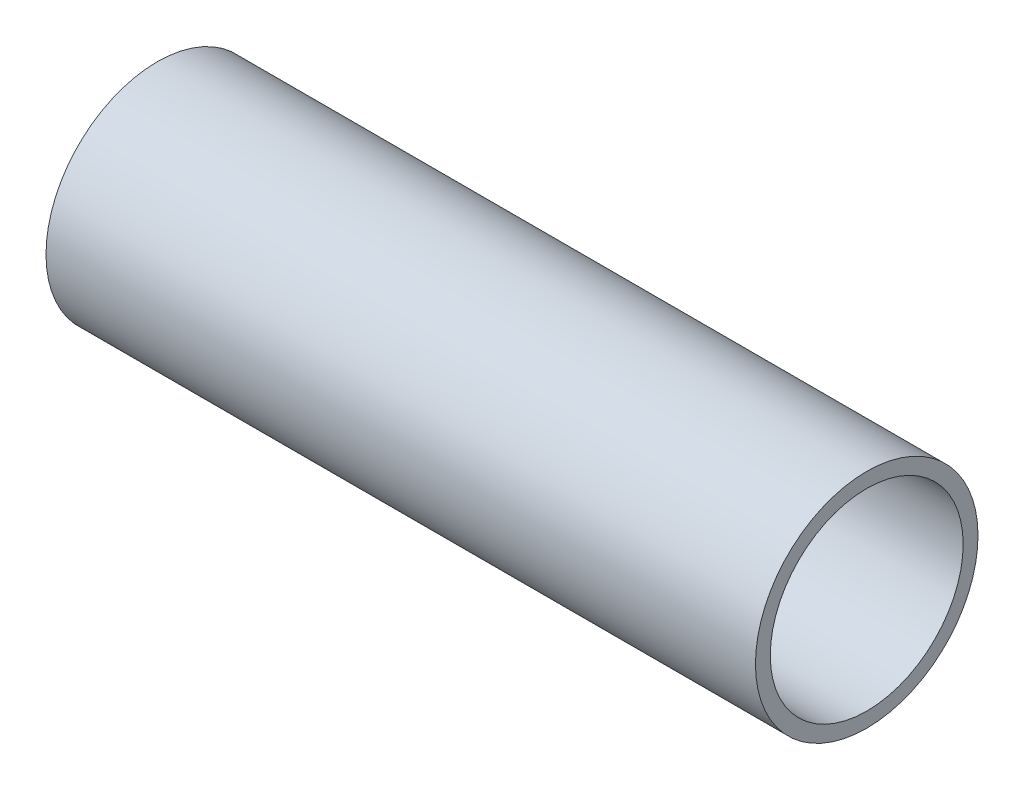
ISO-10303-21;
HEADER;
FILE_DESCRIPTION(('STEP AP214'),'2;1');
FILE_NAME('part.step','',(''),(''),'','','');
FILE_SCHEMA(('AUTOMOTIVE_DESIGN { 1 0 10303 214 1 1 1 1 }'));
ENDSEC;
DATA;
#1=APPLICATION_CONTEXT('core data for automotive mechanical design processes');
#2=APPLICATION_PROTOCOL_DEFINITION('international standard','automotive_design',2000,#1);
#3=PRODUCT_CONTEXT('',#1,'mechanical');
#4=PRODUCT('Part','Part','',(#3));
#5=PRODUCT_RELATED_PRODUCT_CATEGORY('part','',(#4));
#6=PRODUCT_DEFINITION_FORMATION('','',#4);
#7=PRODUCT_DEFINITION_CONTEXT('part definition',#1,'design');
#8=PRODUCT_DEFINITION('design','',#6,#7);
#9=PRODUCT_DEFINITION_SHAPE('','',#8);
#10=(LENGTH_UNIT() NAMED_UNIT(*) SI_UNIT(.MILLI.,.METRE.));
#11=(NAMED_UNIT(*) PLANE_ANGLE_UNIT() SI_UNIT($,.RADIAN.));
#12=(NAMED_UNIT(*) SI_UNIT($,.STERADIAN.) SOLID_ANGLE_UNIT());
#13=UNCERTAINTY_MEASURE_WITH_UNIT(LENGTH_MEASURE(1.E-05),#10,'distance_accuracy_value','');
#14=(GEOMETRIC_REPRESENTATION_CONTEXT(3) GLOBAL_UNCERTAINTY_ASSIGNED_CONTEXT((#13)) GLOBAL_UNIT_ASSIGNED_CONTEXT((#10,
#11,#12)) REPRESENTATION_CONTEXT('',''));
#15=CARTESIAN_POINT('',(0.,0.,0.));
#16=DIRECTION('',(0.,0.,1.));
#17=DIRECTION('',(1.,0.,0.));
#18=AXIS2_PLACEMENT_3D('',#15,#16,#17);
#19=CARTESIAN_POINT('',(47.82,0.,0.));
#20=DIRECTION('',(1.,0.,0.));
#21=DIRECTION('',(0.,0.,-1.));
#22=AXIS2_PLACEMENT_3D('',#19,#20,#21);
#23=PLANE('',#22);
#24=CARTESIAN_POINT('',(47.82,0.,0.));
#25=DIRECTION('',(1.,0.,0.));
#26=DIRECTION('',(0.,0.,-1.));
#27=AXIS2_PLACEMENT_3D('',#24,#25,#26);
#28=CIRCLE('',#27,7.5);
#29=CARTESIAN_POINT('',(47.82,0.,-7.5));
#30=VERTEX_POINT('',#29);
#31=EDGE_CURVE('E12',#30,#30,#28,.T.);
#32=ORIENTED_EDGE('',*,*,#31,.T.);
#33=EDGE_LOOP('',(#32));
#34=FACE_BOUND('',#33,.T.);
#35=CARTESIAN_POINT('',(47.82,0.,0.));
#36=DIRECTION('',(1.,0.,0.));
#37=DIRECTION('',(0.,0.,-1.));
#38=AXIS2_PLACEMENT_3D('',#35,#36,#37);
#39=CIRCLE('',#38,6.5);
#40=CARTESIAN_POINT('',(47.82,0.,-6.5));
#41=VERTEX_POINT('',#40);
#42=EDGE_CURVE('E56',#41,#41,#39,.T.);
#43=ORIENTED_EDGE('',*,*,#42,.F.);
#44=EDGE_LOOP('',(#43));
#45=FACE_BOUND('',#44,.T.);
#46=ADVANCED_FACE('F45',(#34,#45),#23,.T.);
#47=CARTESIAN_POINT('',(0.,0.,0.));
#48=DIRECTION('',(1.,0.,0.));
#49=DIRECTION('',(0.,0.,-1.));
#50=AXIS2_PLACEMENT_3D('',#47,#48,#49);
#51=PLANE('',#50);
#52=CARTESIAN_POINT('',(0.,0.,0.));
#53=DIRECTION('',(1.,0.,0.));
#54=DIRECTION('',(0.,0.,-1.));
#55=AXIS2_PLACEMENT_3D('',#52,#53,#54);
#56=CIRCLE('',#55,7.5);
#57=CARTESIAN_POINT('',(0.,0.,-7.5));
#58=VERTEX_POINT('',#57);
#59=EDGE_CURVE('E49',#58,#58,#56,.T.);
#60=ORIENTED_EDGE('',*,*,#59,.F.);
#61=EDGE_LOOP('',(#60));
#62=FACE_BOUND('',#61,.T.);
#63=CARTESIAN_POINT('',(0.,0.,0.));
#64=DIRECTION('',(1.,0.,0.));
#65=DIRECTION('',(0.,0.,-1.));
#66=AXIS2_PLACEMENT_3D('',#63,#64,#65);
#67=CIRCLE('',#66,6.5);
#68=CARTESIAN_POINT('',(0.,0.,-6.5));
#69=VERTEX_POINT('',#68);
#70=EDGE_CURVE('E58',#69,#69,#67,.T.);
#71=ORIENTED_EDGE('',*,*,#70,.T.);
#72=EDGE_LOOP('',(#71));
#73=FACE_BOUND('',#72,.T.);
#74=ADVANCED_FACE('F68',(#62,#73),#51,.F.);
#75=CARTESIAN_POINT('',(47.82,0.,0.));
#76=DIRECTION('',(-1.,0.,0.));
#77=DIRECTION('',(0.,0.,1.));
#78=AXIS2_PLACEMENT_3D('',#75,#76,#77);
#79=CYLINDRICAL_SURFACE('',#78,7.5);
#80=ORIENTED_EDGE('',*,*,#31,.F.);
#81=EDGE_LOOP('',(#80));
#82=FACE_BOUND('',#81,.T.);
#83=ORIENTED_EDGE('',*,*,#59,.T.);
#84=EDGE_LOOP('',(#83));
#85=FACE_BOUND('',#84,.T.);
#86=ADVANCED_FACE('F47',(#82,#85),#79,.T.);
#87=CARTESIAN_POINT('',(47.82,0.,0.));
#88=DIRECTION('',(-1.,0.,0.));
#89=DIRECTION('',(0.,0.,1.));
#90=AXIS2_PLACEMENT_3D('',#87,#88,#89);
#91=CYLINDRICAL_SURFACE('',#90,6.5);
#92=ORIENTED_EDGE('',*,*,#42,.T.);
#93=EDGE_LOOP('',(#92));
#94=FACE_BOUND('',#93,.T.);
#95=ORIENTED_EDGE('',*,*,#70,.F.);
#96=EDGE_LOOP('',(#95));
#97=FACE_BOUND('',#96,.T.);
#98=ADVANCED_FACE('F64',(#94,#97),#91,.F.);
#99=CLOSED_SHELL('',(#46,#74,#86,#98));
#100=MANIFOLD_SOLID_BREP('B2',#99);
#101=ADVANCED_BREP_SHAPE_REPRESENTATION('',(#18,#100),#14);
#102=SHAPE_DEFINITION_REPRESENTATION(#9,#101);
ENDSEC;
END-ISO-10303-21;
